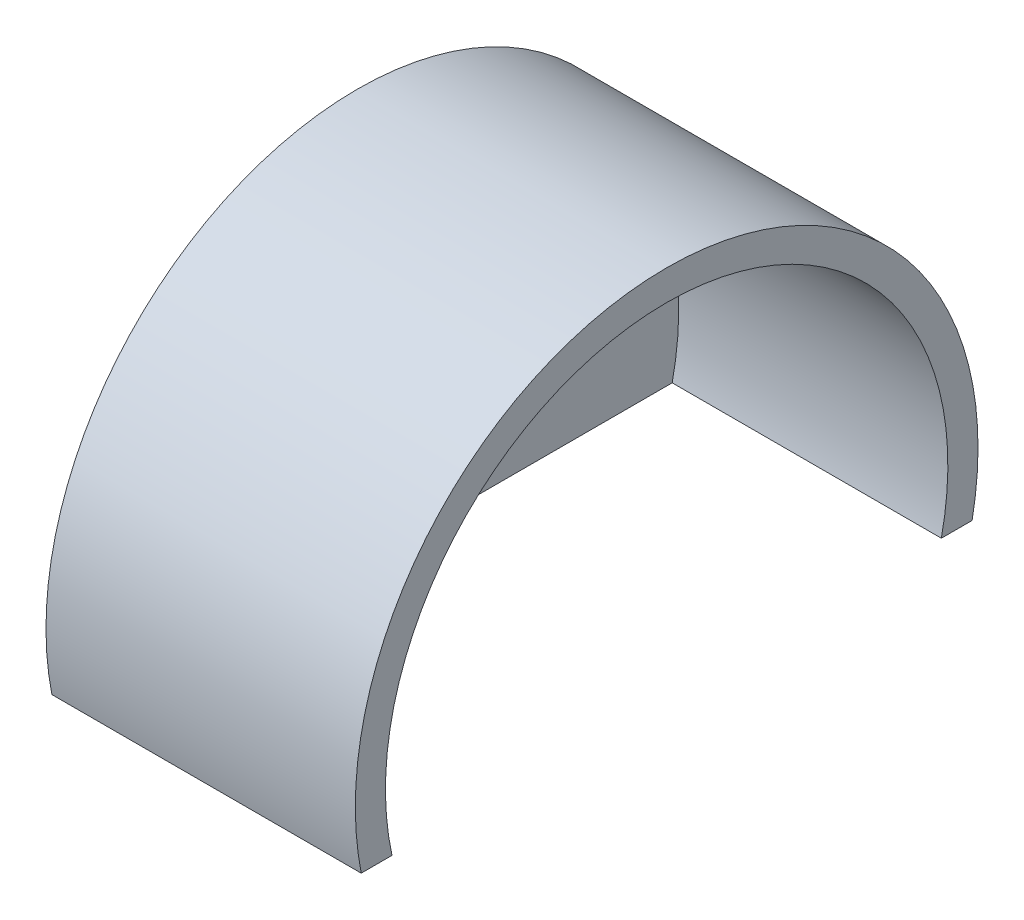
ISO-10303-21;
HEADER;
FILE_DESCRIPTION(('STEP AP214'),'2;1');
FILE_NAME('part.step','',(''),(''),'','','');
FILE_SCHEMA(('AUTOMOTIVE_DESIGN { 1 0 10303 214 1 1 1 1 }'));
ENDSEC;
DATA;
#1=APPLICATION_CONTEXT('core data for automotive mechanical design processes');
#2=APPLICATION_PROTOCOL_DEFINITION('international standard','automotive_design',2000,#1);
#3=PRODUCT_CONTEXT('',#1,'mechanical');
#4=PRODUCT('Part','Part','',(#3));
#5=PRODUCT_RELATED_PRODUCT_CATEGORY('part','',(#4));
#6=PRODUCT_DEFINITION_FORMATION('','',#4);
#7=PRODUCT_DEFINITION_CONTEXT('part definition',#1,'design');
#8=PRODUCT_DEFINITION('design','',#6,#7);
#9=PRODUCT_DEFINITION_SHAPE('','',#8);
#10=(LENGTH_UNIT() NAMED_UNIT(*) SI_UNIT(.MILLI.,.METRE.));
#11=(NAMED_UNIT(*) PLANE_ANGLE_UNIT() SI_UNIT($,.RADIAN.));
#12=(NAMED_UNIT(*) SI_UNIT($,.STERADIAN.) SOLID_ANGLE_UNIT());
#13=UNCERTAINTY_MEASURE_WITH_UNIT(LENGTH_MEASURE(1.E-05),#10,'distance_accuracy_value','');
#14=(GEOMETRIC_REPRESENTATION_CONTEXT(3) GLOBAL_UNCERTAINTY_ASSIGNED_CONTEXT((#13)) GLOBAL_UNIT_ASSIGNED_CONTEXT((#10,
#11,#12)) REPRESENTATION_CONTEXT('',''));
#15=CARTESIAN_POINT('',(0.,0.,0.));
#16=DIRECTION('',(0.,0.,1.));
#17=DIRECTION('',(1.,0.,0.));
#18=AXIS2_PLACEMENT_3D('',#15,#16,#17);
#19=CARTESIAN_POINT('',(4.,0.,0.));
#20=DIRECTION('',(-1.,0.,0.));
#21=DIRECTION('',(0.,0.,1.));
#22=AXIS2_PLACEMENT_3D('',#19,#20,#21);
#23=CYLINDRICAL_SURFACE('',#22,31.);
#24=CARTESIAN_POINT('',(0.,0.,0.));
#25=DIRECTION('',(1.,0.,0.));
#26=DIRECTION('',(0.,0.,-1.));
#27=AXIS2_PLACEMENT_3D('',#24,#25,#26);
#28=CIRCLE('',#27,31.);
#29=CARTESIAN_POINT('',(0.,-6.,-30.4138126514911));
#30=VERTEX_POINT('',#29);
#31=CARTESIAN_POINT('',(0.,-6.,30.4138126514911));
#32=VERTEX_POINT('',#31);
#33=EDGE_CURVE('E89',#30,#32,#28,.T.);
#34=ORIENTED_EDGE('',*,*,#33,.T.);
#35=DIRECTION('',(-1.,0.,0.));
#36=VECTOR('',#35,1.);
#37=CARTESIAN_POINT('',(4.,-6.,30.4138126514911));
#38=LINE('',#37,#36);
#39=CARTESIAN_POINT('',(30.8,-6.,30.4138126514911));
#40=VERTEX_POINT('',#39);
#41=EDGE_CURVE('E11',#40,#32,#38,.T.);
#42=ORIENTED_EDGE('',*,*,#41,.F.);
#43=CARTESIAN_POINT('',(30.8,0.,0.));
#44=DIRECTION('',(1.,0.,0.));
#45=DIRECTION('',(0.,0.,-1.));
#46=AXIS2_PLACEMENT_3D('',#43,#44,#45);
#47=CIRCLE('',#46,31.);
#48=CARTESIAN_POINT('',(30.8,-6.,-30.4138126514911));
#49=VERTEX_POINT('',#48);
#50=EDGE_CURVE('E87',#49,#40,#47,.T.);
#51=ORIENTED_EDGE('',*,*,#50,.F.);
#52=DIRECTION('',(-1.,0.,0.));
#53=VECTOR('',#52,1.);
#54=CARTESIAN_POINT('',(4.,-6.,-30.4138126514911));
#55=LINE('',#54,#53);
#56=EDGE_CURVE('E48',#49,#30,#55,.T.);
#57=ORIENTED_EDGE('',*,*,#56,.T.);
#58=EDGE_LOOP('',(#34,#42,#51,#57));
#59=FACE_BOUND('',#58,.T.);
#60=ADVANCED_FACE('F39',(#59),#23,.T.);
#61=CARTESIAN_POINT('',(4.,-6.,30.4138126514911));
#62=DIRECTION('',(0.,1.,0.));
#63=DIRECTION('',(0.,0.,1.));
#64=AXIS2_PLACEMENT_3D('',#61,#62,#63);
#65=PLANE('',#64);
#66=DIRECTION('',(0.,0.,-1.));
#67=VECTOR('',#66,1.);
#68=CARTESIAN_POINT('',(0.,-6.,30.4138126514911));
#69=LINE('',#68,#67);
#70=EDGE_CURVE('E65',#32,#30,#69,.T.);
#71=ORIENTED_EDGE('',*,*,#70,.T.);
#72=ORIENTED_EDGE('',*,*,#56,.F.);
#73=DIRECTION('',(0.,0.,-1.));
#74=VECTOR('',#73,1.);
#75=CARTESIAN_POINT('',(30.8,-6.,-27.3495886623547));
#76=LINE('',#75,#74);
#77=CARTESIAN_POINT('',(30.8,-6.,-27.3495886623547));
#78=VERTEX_POINT('',#77);
#79=EDGE_CURVE('E103',#78,#49,#76,.T.);
#80=ORIENTED_EDGE('',*,*,#79,.F.);
#81=DIRECTION('',(-1.,0.,0.));
#82=VECTOR('',#81,1.);
#83=CARTESIAN_POINT('',(30.8,-6.,-27.3495886623547));
#84=LINE('',#83,#82);
#85=CARTESIAN_POINT('',(4.,-6.,-27.3495886623547));
#86=VERTEX_POINT('',#85);
#87=EDGE_CURVE('E112',#78,#86,#84,.T.);
#88=ORIENTED_EDGE('',*,*,#87,.T.);
#89=DIRECTION('',(0.,0.,-1.));
#90=VECTOR('',#89,1.);
#91=CARTESIAN_POINT('',(4.,-6.,30.4138126514911));
#92=LINE('',#91,#90);
#93=CARTESIAN_POINT('',(4.,-6.,27.3495886623547));
#94=VERTEX_POINT('',#93);
#95=EDGE_CURVE('E119',#94,#86,#92,.T.);
#96=ORIENTED_EDGE('',*,*,#95,.F.);
#97=DIRECTION('',(-1.,0.,0.));
#98=VECTOR('',#97,1.);
#99=CARTESIAN_POINT('',(30.8,-5.99999999999998,27.3495886623547));
#100=LINE('',#99,#98);
#101=CARTESIAN_POINT('',(30.8,-5.99999999999998,27.3495886623547));
#102=VERTEX_POINT('',#101);
#103=EDGE_CURVE('E94',#102,#94,#100,.T.);
#104=ORIENTED_EDGE('',*,*,#103,.F.);
#105=DIRECTION('',(0.,0.,-1.));
#106=VECTOR('',#105,1.);
#107=CARTESIAN_POINT('',(30.8,-6.,30.4138126514911));
#108=LINE('',#107,#106);
#109=EDGE_CURVE('E91',#40,#102,#108,.T.);
#110=ORIENTED_EDGE('',*,*,#109,.F.);
#111=ORIENTED_EDGE('',*,*,#41,.T.);
#112=EDGE_LOOP('',(#71,#72,#80,#88,#96,#104,#110,#111));
#113=FACE_BOUND('',#112,.T.);
#114=ADVANCED_FACE('F92',(#113),#65,.F.);
#115=CARTESIAN_POINT('',(4.,0.,0.));
#116=DIRECTION('',(1.,0.,0.));
#117=DIRECTION('',(0.,0.,-1.));
#118=AXIS2_PLACEMENT_3D('',#115,#116,#117);
#119=PLANE('',#118);
#120=CARTESIAN_POINT('',(4.,0.,0.));
#121=DIRECTION('',(-1.,0.,0.));
#122=DIRECTION('',(0.,0.,-1.));
#123=AXIS2_PLACEMENT_3D('',#120,#121,#122);
#124=CIRCLE('',#123,28.);
#125=EDGE_CURVE('E58',#94,#86,#124,.T.);
#126=ORIENTED_EDGE('',*,*,#125,.F.);
#127=ORIENTED_EDGE('',*,*,#95,.T.);
#128=EDGE_LOOP('',(#126,#127));
#129=FACE_BOUND('',#128,.T.);
#130=ADVANCED_FACE('F130',(#129),#119,.T.);
#131=CARTESIAN_POINT('',(0.,0.,0.));
#132=DIRECTION('',(1.,0.,0.));
#133=DIRECTION('',(0.,0.,-1.));
#134=AXIS2_PLACEMENT_3D('',#131,#132,#133);
#135=PLANE('',#134);
#136=ORIENTED_EDGE('',*,*,#33,.F.);
#137=ORIENTED_EDGE('',*,*,#70,.F.);
#138=EDGE_LOOP('',(#136,#137));
#139=FACE_BOUND('',#138,.T.);
#140=ADVANCED_FACE('F134',(#139),#135,.F.);
#141=CARTESIAN_POINT('',(30.8,0.,0.));
#142=DIRECTION('',(-1.,0.,0.));
#143=DIRECTION('',(0.,0.,1.));
#144=AXIS2_PLACEMENT_3D('',#141,#142,#143);
#145=CYLINDRICAL_SURFACE('',#144,28.);
#146=ORIENTED_EDGE('',*,*,#125,.T.);
#147=ORIENTED_EDGE('',*,*,#87,.F.);
#148=CARTESIAN_POINT('',(30.8,0.,0.));
#149=DIRECTION('',(-1.,0.,0.));
#150=DIRECTION('',(0.,0.,-1.));
#151=AXIS2_PLACEMENT_3D('',#148,#149,#150);
#152=CIRCLE('',#151,28.);
#153=EDGE_CURVE('E98',#102,#78,#152,.T.);
#154=ORIENTED_EDGE('',*,*,#153,.F.);
#155=ORIENTED_EDGE('',*,*,#103,.T.);
#156=EDGE_LOOP('',(#146,#147,#154,#155));
#157=FACE_BOUND('',#156,.T.);
#158=ADVANCED_FACE('F132',(#157),#145,.F.);
#159=CARTESIAN_POINT('',(30.8,0.,0.));
#160=DIRECTION('',(1.,0.,0.));
#161=DIRECTION('',(0.,0.,-1.));
#162=AXIS2_PLACEMENT_3D('',#159,#160,#161);
#163=PLANE('',#162);
#164=ORIENTED_EDGE('',*,*,#50,.T.);
#165=ORIENTED_EDGE('',*,*,#109,.T.);
#166=ORIENTED_EDGE('',*,*,#153,.T.);
#167=ORIENTED_EDGE('',*,*,#79,.T.);
#168=EDGE_LOOP('',(#164,#165,#166,#167));
#169=FACE_BOUND('',#168,.T.);
#170=ADVANCED_FACE('F101',(#169),#163,.T.);
#171=CLOSED_SHELL('',(#60,#114,#130,#140,#158,#170));
#172=MANIFOLD_SOLID_BREP('B2',#171);
#173=ADVANCED_BREP_SHAPE_REPRESENTATION('',(#18,#172),#14);
#174=SHAPE_DEFINITION_REPRESENTATION(#9,#173);
ENDSEC;
END-ISO-10303-21;
